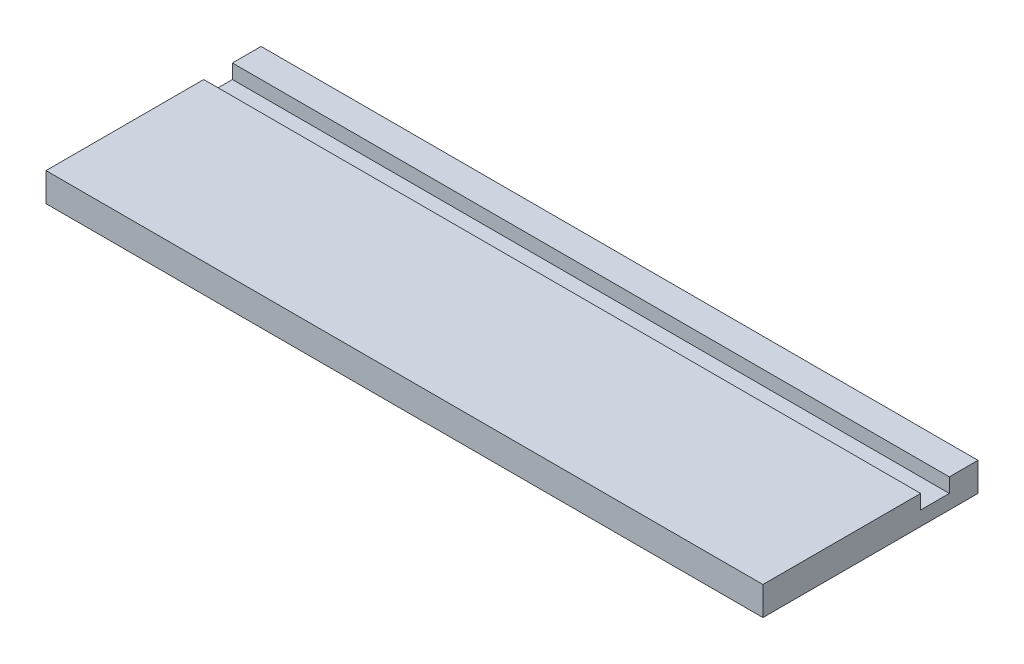
ISO-10303-21;
HEADER;
FILE_DESCRIPTION(('STEP AP214'),'2;1');
FILE_NAME('part.step','',(''),(''),'','','');
FILE_SCHEMA(('AUTOMOTIVE_DESIGN { 1 0 10303 214 1 1 1 1 }'));
ENDSEC;
DATA;
#1=APPLICATION_CONTEXT('core data for automotive mechanical design processes');
#2=APPLICATION_PROTOCOL_DEFINITION('international standard','automotive_design',2000,#1);
#3=PRODUCT_CONTEXT('',#1,'mechanical');
#4=PRODUCT('Part','Part','',(#3));
#5=PRODUCT_RELATED_PRODUCT_CATEGORY('part','',(#4));
#6=PRODUCT_DEFINITION_FORMATION('','',#4);
#7=PRODUCT_DEFINITION_CONTEXT('part definition',#1,'design');
#8=PRODUCT_DEFINITION('design','',#6,#7);
#9=PRODUCT_DEFINITION_SHAPE('','',#8);
#10=(LENGTH_UNIT() NAMED_UNIT(*) SI_UNIT(.MILLI.,.METRE.));
#11=(NAMED_UNIT(*) PLANE_ANGLE_UNIT() SI_UNIT($,.RADIAN.));
#12=(NAMED_UNIT(*) SI_UNIT($,.STERADIAN.) SOLID_ANGLE_UNIT());
#13=UNCERTAINTY_MEASURE_WITH_UNIT(LENGTH_MEASURE(1.E-05),#10,'distance_accuracy_value','');
#14=(GEOMETRIC_REPRESENTATION_CONTEXT(3) GLOBAL_UNCERTAINTY_ASSIGNED_CONTEXT((#13)) GLOBAL_UNIT_ASSIGNED_CONTEXT((#10,
#11,#12)) REPRESENTATION_CONTEXT('',''));
#15=CARTESIAN_POINT('',(0.,0.,0.));
#16=DIRECTION('',(0.,0.,1.));
#17=DIRECTION('',(1.,0.,0.));
#18=AXIS2_PLACEMENT_3D('',#15,#16,#17);
#19=CARTESIAN_POINT('',(0.,20.,0.));
#20=DIRECTION('',(0.,1.,0.));
#21=DIRECTION('',(0.,0.,1.));
#22=AXIS2_PLACEMENT_3D('',#19,#20,#21);
#23=PLANE('',#22);
#24=DIRECTION('',(-1.,0.,0.));
#25=VECTOR('',#24,1.);
#26=CARTESIAN_POINT('',(-250.,20.,-55.));
#27=LINE('',#26,#25);
#28=CARTESIAN_POINT('',(250.,20.,-55.));
#29=VERTEX_POINT('',#28);
#30=CARTESIAN_POINT('',(-250.,20.,-55.));
#31=VERTEX_POINT('',#30);
#32=EDGE_CURVE('E130',#29,#31,#27,.T.);
#33=ORIENTED_EDGE('',*,*,#32,.F.);
#34=DIRECTION('',(0.,0.,-1.));
#35=VECTOR('',#34,1.);
#36=CARTESIAN_POINT('',(250.,20.,-75.));
#37=LINE('',#36,#35);
#38=CARTESIAN_POINT('',(250.,20.,-75.));
#39=VERTEX_POINT('',#38);
#40=EDGE_CURVE('E92',#29,#39,#37,.T.);
#41=ORIENTED_EDGE('',*,*,#40,.T.);
#42=DIRECTION('',(-1.,0.,0.));
#43=VECTOR('',#42,1.);
#44=CARTESIAN_POINT('',(-250.,20.,-75.));
#45=LINE('',#44,#43);
#46=CARTESIAN_POINT('',(-250.,20.,-75.));
#47=VERTEX_POINT('',#46);
#48=EDGE_CURVE('E144',#39,#47,#45,.T.);
#49=ORIENTED_EDGE('',*,*,#48,.T.);
#50=DIRECTION('',(0.,0.,1.));
#51=VECTOR('',#50,1.);
#52=CARTESIAN_POINT('',(-250.,20.,-75.));
#53=LINE('',#52,#51);
#54=EDGE_CURVE('E146',#47,#31,#53,.T.);
#55=ORIENTED_EDGE('',*,*,#54,.T.);
#56=EDGE_LOOP('',(#33,#41,#49,#55));
#57=FACE_BOUND('',#56,.T.);
#58=ADVANCED_FACE('F39',(#57),#23,.T.);
#59=CARTESIAN_POINT('',(250.,20.,-75.));
#60=DIRECTION('',(-1.,0.,0.));
#61=DIRECTION('',(0.,0.,1.));
#62=AXIS2_PLACEMENT_3D('',#59,#60,#61);
#63=PLANE('',#62);
#64=ORIENTED_EDGE('',*,*,#40,.F.);
#65=DIRECTION('',(0.,1.,0.));
#66=VECTOR('',#65,1.);
#67=CARTESIAN_POINT('',(250.,10.,-55.));
#68=LINE('',#67,#66);
#69=CARTESIAN_POINT('',(250.,10.,-55.));
#70=VERTEX_POINT('',#69);
#71=EDGE_CURVE('E137',#70,#29,#68,.T.);
#72=ORIENTED_EDGE('',*,*,#71,.F.);
#73=DIRECTION('',(0.,0.,-1.));
#74=VECTOR('',#73,1.);
#75=CARTESIAN_POINT('',(250.,10.,-55.));
#76=LINE('',#75,#74);
#77=CARTESIAN_POINT('',(250.,10.,-35.));
#78=VERTEX_POINT('',#77);
#79=EDGE_CURVE('E120',#78,#70,#76,.T.);
#80=ORIENTED_EDGE('',*,*,#79,.F.);
#81=DIRECTION('',(0.,1.,0.));
#82=VECTOR('',#81,1.);
#83=CARTESIAN_POINT('',(250.,10.,-35.));
#84=LINE('',#83,#82);
#85=CARTESIAN_POINT('',(250.,20.,-35.));
#86=VERTEX_POINT('',#85);
#87=EDGE_CURVE('E117',#78,#86,#84,.T.);
#88=ORIENTED_EDGE('',*,*,#87,.T.);
#89=CARTESIAN_POINT('',(250.,20.,75.));
#90=VERTEX_POINT('',#89);
#91=EDGE_CURVE('E142',#90,#86,#37,.T.);
#92=ORIENTED_EDGE('',*,*,#91,.F.);
#93=DIRECTION('',(0.,-1.,0.));
#94=VECTOR('',#93,1.);
#95=CARTESIAN_POINT('',(250.,20.,75.));
#96=LINE('',#95,#94);
#97=CARTESIAN_POINT('',(250.,0.,75.));
#98=VERTEX_POINT('',#97);
#99=EDGE_CURVE('E150',#90,#98,#96,.T.);
#100=ORIENTED_EDGE('',*,*,#99,.T.);
#101=DIRECTION('',(0.,0.,-1.));
#102=VECTOR('',#101,1.);
#103=CARTESIAN_POINT('',(250.,0.,-75.));
#104=LINE('',#103,#102);
#105=CARTESIAN_POINT('',(250.,0.,-75.));
#106=VERTEX_POINT('',#105);
#107=EDGE_CURVE('E151',#98,#106,#104,.T.);
#108=ORIENTED_EDGE('',*,*,#107,.T.);
#109=DIRECTION('',(0.,-1.,0.));
#110=VECTOR('',#109,1.);
#111=CARTESIAN_POINT('',(250.,20.,-75.));
#112=LINE('',#111,#110);
#113=EDGE_CURVE('E11',#39,#106,#112,.T.);
#114=ORIENTED_EDGE('',*,*,#113,.F.);
#115=EDGE_LOOP('',(#64,#72,#80,#88,#92,#100,#108,#114));
#116=FACE_BOUND('',#115,.T.);
#117=ADVANCED_FACE('F41',(#116),#63,.F.);
#118=CARTESIAN_POINT('',(-250.,20.,-75.));
#119=DIRECTION('',(0.,0.,1.));
#120=DIRECTION('',(1.,0.,0.));
#121=AXIS2_PLACEMENT_3D('',#118,#119,#120);
#122=PLANE('',#121);
#123=DIRECTION('',(-1.,0.,0.));
#124=VECTOR('',#123,1.);
#125=CARTESIAN_POINT('',(-250.,0.,-75.));
#126=LINE('',#125,#124);
#127=CARTESIAN_POINT('',(-250.,0.,-75.));
#128=VERTEX_POINT('',#127);
#129=EDGE_CURVE('E154',#106,#128,#126,.T.);
#130=ORIENTED_EDGE('',*,*,#129,.T.);
#131=DIRECTION('',(0.,-1.,0.));
#132=VECTOR('',#131,1.);
#133=CARTESIAN_POINT('',(-250.,20.,-75.));
#134=LINE('',#133,#132);
#135=EDGE_CURVE('E47',#47,#128,#134,.T.);
#136=ORIENTED_EDGE('',*,*,#135,.F.);
#137=ORIENTED_EDGE('',*,*,#48,.F.);
#138=ORIENTED_EDGE('',*,*,#113,.T.);
#139=EDGE_LOOP('',(#130,#136,#137,#138));
#140=FACE_BOUND('',#139,.T.);
#141=ADVANCED_FACE('F182',(#140),#122,.F.);
#142=CARTESIAN_POINT('',(-250.,20.,-75.));
#143=DIRECTION('',(1.,0.,0.));
#144=DIRECTION('',(0.,0.,-1.));
#145=AXIS2_PLACEMENT_3D('',#142,#143,#144);
#146=PLANE('',#145);
#147=DIRECTION('',(0.,0.,1.));
#148=VECTOR('',#147,1.);
#149=CARTESIAN_POINT('',(-250.,10.,-55.));
#150=LINE('',#149,#148);
#151=CARTESIAN_POINT('',(-250.,10.,-55.));
#152=VERTEX_POINT('',#151);
#153=CARTESIAN_POINT('',(-250.,10.,-35.));
#154=VERTEX_POINT('',#153);
#155=EDGE_CURVE('E121',#152,#154,#150,.T.);
#156=ORIENTED_EDGE('',*,*,#155,.F.);
#157=DIRECTION('',(0.,1.,0.));
#158=VECTOR('',#157,1.);
#159=CARTESIAN_POINT('',(-250.,10.,-55.));
#160=LINE('',#159,#158);
#161=EDGE_CURVE('E155',#152,#31,#160,.T.);
#162=ORIENTED_EDGE('',*,*,#161,.T.);
#163=ORIENTED_EDGE('',*,*,#54,.F.);
#164=ORIENTED_EDGE('',*,*,#135,.T.);
#165=DIRECTION('',(0.,0.,1.));
#166=VECTOR('',#165,1.);
#167=CARTESIAN_POINT('',(-250.,0.,-75.));
#168=LINE('',#167,#166);
#169=CARTESIAN_POINT('',(-250.,0.,75.));
#170=VERTEX_POINT('',#169);
#171=EDGE_CURVE('E157',#128,#170,#168,.T.);
#172=ORIENTED_EDGE('',*,*,#171,.T.);
#173=DIRECTION('',(0.,-1.,0.));
#174=VECTOR('',#173,1.);
#175=CARTESIAN_POINT('',(-250.,20.,75.));
#176=LINE('',#175,#174);
#177=CARTESIAN_POINT('',(-250.,20.,75.));
#178=VERTEX_POINT('',#177);
#179=EDGE_CURVE('E161',#178,#170,#176,.T.);
#180=ORIENTED_EDGE('',*,*,#179,.F.);
#181=CARTESIAN_POINT('',(-250.,20.,-35.));
#182=VERTEX_POINT('',#181);
#183=EDGE_CURVE('E135',#182,#178,#53,.T.);
#184=ORIENTED_EDGE('',*,*,#183,.F.);
#185=DIRECTION('',(0.,1.,0.));
#186=VECTOR('',#185,1.);
#187=CARTESIAN_POINT('',(-250.,10.,-35.));
#188=LINE('',#187,#186);
#189=EDGE_CURVE('E54',#154,#182,#188,.T.);
#190=ORIENTED_EDGE('',*,*,#189,.F.);
#191=EDGE_LOOP('',(#156,#162,#163,#164,#172,#180,#184,#190));
#192=FACE_BOUND('',#191,.T.);
#193=ADVANCED_FACE('F133',(#192),#146,.F.);
#194=CARTESIAN_POINT('',(-250.,20.,75.));
#195=DIRECTION('',(0.,0.,-1.));
#196=DIRECTION('',(-1.,0.,0.));
#197=AXIS2_PLACEMENT_3D('',#194,#195,#196);
#198=PLANE('',#197);
#199=DIRECTION('',(1.,0.,0.));
#200=VECTOR('',#199,1.);
#201=CARTESIAN_POINT('',(-250.,0.,75.));
#202=LINE('',#201,#200);
#203=EDGE_CURVE('E84',#170,#98,#202,.T.);
#204=ORIENTED_EDGE('',*,*,#203,.T.);
#205=ORIENTED_EDGE('',*,*,#99,.F.);
#206=DIRECTION('',(1.,0.,0.));
#207=VECTOR('',#206,1.);
#208=CARTESIAN_POINT('',(-250.,20.,75.));
#209=LINE('',#208,#207);
#210=EDGE_CURVE('E63',#178,#90,#209,.T.);
#211=ORIENTED_EDGE('',*,*,#210,.F.);
#212=ORIENTED_EDGE('',*,*,#179,.T.);
#213=EDGE_LOOP('',(#204,#205,#211,#212));
#214=FACE_BOUND('',#213,.T.);
#215=ADVANCED_FACE('F173',(#214),#198,.F.);
#216=DIRECTION('',(1.,0.,0.));
#217=VECTOR('',#216,1.);
#218=CARTESIAN_POINT('',(-250.,20.,-35.));
#219=LINE('',#218,#217);
#220=EDGE_CURVE('E267',#182,#86,#219,.T.);
#221=ORIENTED_EDGE('',*,*,#220,.F.);
#222=ORIENTED_EDGE('',*,*,#183,.T.);
#223=ORIENTED_EDGE('',*,*,#210,.T.);
#224=ORIENTED_EDGE('',*,*,#91,.T.);
#225=EDGE_LOOP('',(#221,#222,#223,#224));
#226=FACE_BOUND('',#225,.T.);
#227=ADVANCED_FACE('F175',(#226),#23,.T.);
#228=CARTESIAN_POINT('',(0.,0.,0.));
#229=DIRECTION('',(0.,1.,0.));
#230=DIRECTION('',(0.,0.,1.));
#231=AXIS2_PLACEMENT_3D('',#228,#229,#230);
#232=PLANE('',#231);
#233=ORIENTED_EDGE('',*,*,#107,.F.);
#234=ORIENTED_EDGE('',*,*,#203,.F.);
#235=ORIENTED_EDGE('',*,*,#171,.F.);
#236=ORIENTED_EDGE('',*,*,#129,.F.);
#237=EDGE_LOOP('',(#233,#234,#235,#236));
#238=FACE_BOUND('',#237,.T.);
#239=ADVANCED_FACE('F169',(#238),#232,.F.);
#240=CARTESIAN_POINT('',(-250.,10.,-55.));
#241=DIRECTION('',(0.,0.,-1.));
#242=DIRECTION('',(-1.,0.,0.));
#243=AXIS2_PLACEMENT_3D('',#240,#241,#242);
#244=PLANE('',#243);
#245=ORIENTED_EDGE('',*,*,#32,.T.);
#246=ORIENTED_EDGE('',*,*,#161,.F.);
#247=DIRECTION('',(-1.,0.,0.));
#248=VECTOR('',#247,1.);
#249=CARTESIAN_POINT('',(-250.,10.,-55.));
#250=LINE('',#249,#248);
#251=EDGE_CURVE('E127',#70,#152,#250,.T.);
#252=ORIENTED_EDGE('',*,*,#251,.F.);
#253=ORIENTED_EDGE('',*,*,#71,.T.);
#254=EDGE_LOOP('',(#245,#246,#252,#253));
#255=FACE_BOUND('',#254,.T.);
#256=ADVANCED_FACE('F192',(#255),#244,.F.);
#257=CARTESIAN_POINT('',(-250.,10.,-35.));
#258=DIRECTION('',(0.,0.,1.));
#259=DIRECTION('',(1.,0.,0.));
#260=AXIS2_PLACEMENT_3D('',#257,#258,#259);
#261=PLANE('',#260);
#262=ORIENTED_EDGE('',*,*,#220,.T.);
#263=ORIENTED_EDGE('',*,*,#87,.F.);
#264=DIRECTION('',(1.,0.,0.));
#265=VECTOR('',#264,1.);
#266=CARTESIAN_POINT('',(-250.,10.,-35.));
#267=LINE('',#266,#265);
#268=EDGE_CURVE('E113',#154,#78,#267,.T.);
#269=ORIENTED_EDGE('',*,*,#268,.F.);
#270=ORIENTED_EDGE('',*,*,#189,.T.);
#271=EDGE_LOOP('',(#262,#263,#269,#270));
#272=FACE_BOUND('',#271,.T.);
#273=ADVANCED_FACE('F115',(#272),#261,.F.);
#274=CARTESIAN_POINT('',(0.,10.,0.));
#275=DIRECTION('',(0.,1.,0.));
#276=DIRECTION('',(0.,0.,1.));
#277=AXIS2_PLACEMENT_3D('',#274,#275,#276);
#278=PLANE('',#277);
#279=ORIENTED_EDGE('',*,*,#155,.T.);
#280=ORIENTED_EDGE('',*,*,#268,.T.);
#281=ORIENTED_EDGE('',*,*,#79,.T.);
#282=ORIENTED_EDGE('',*,*,#251,.T.);
#283=EDGE_LOOP('',(#279,#280,#281,#282));
#284=FACE_BOUND('',#283,.T.);
#285=ADVANCED_FACE('F125',(#284),#278,.T.);
#286=CLOSED_SHELL('',(#58,#117,#141,#193,#215,#227,#239,#256,#273,#285));
#287=MANIFOLD_SOLID_BREP('B2',#286);
#288=ADVANCED_BREP_SHAPE_REPRESENTATION('',(#18,#287),#14);
#289=SHAPE_DEFINITION_REPRESENTATION(#9,#288);
ENDSEC;
END-ISO-10303-21;
